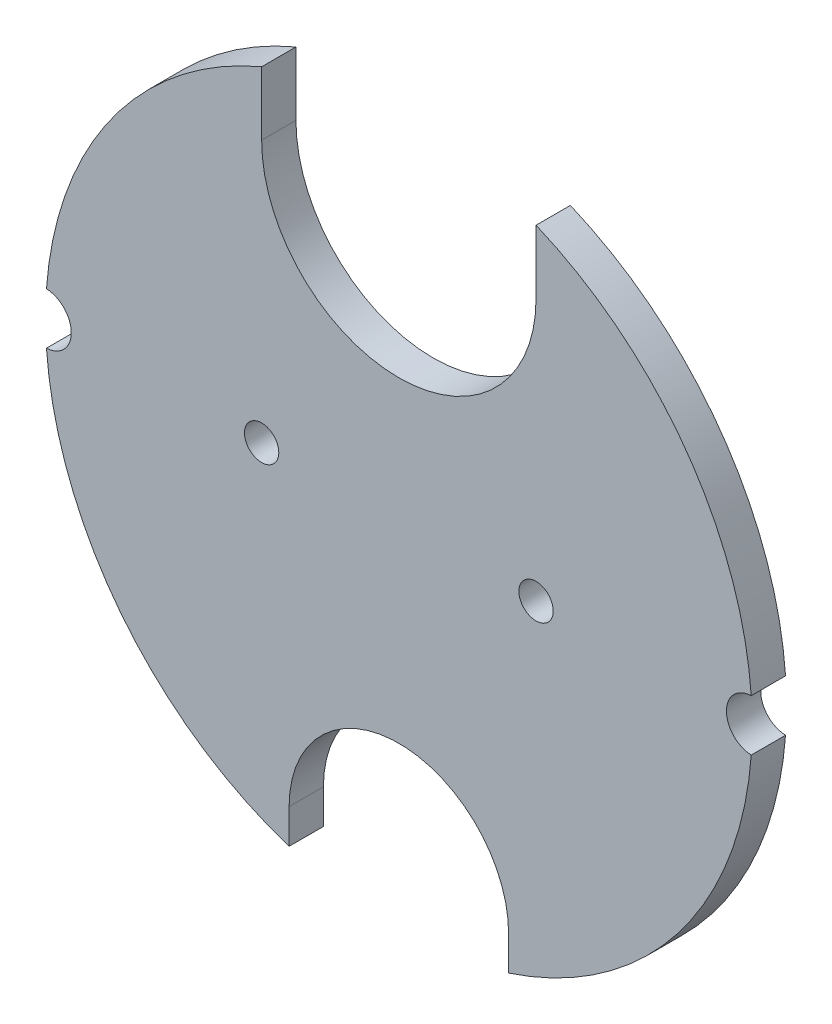
ISO-10303-21;
HEADER;
FILE_DESCRIPTION(('STEP AP214'),'2;1');
FILE_NAME('part.step','',(''),(''),'','','');
FILE_SCHEMA(('AUTOMOTIVE_DESIGN { 1 0 10303 214 1 1 1 1 }'));
ENDSEC;
DATA;
#1=APPLICATION_CONTEXT('core data for automotive mechanical design processes');
#2=APPLICATION_PROTOCOL_DEFINITION('international standard','automotive_design',2000,#1);
#3=PRODUCT_CONTEXT('',#1,'mechanical');
#4=PRODUCT('Part','Part','',(#3));
#5=PRODUCT_RELATED_PRODUCT_CATEGORY('part','',(#4));
#6=PRODUCT_DEFINITION_FORMATION('','',#4);
#7=PRODUCT_DEFINITION_CONTEXT('part definition',#1,'design');
#8=PRODUCT_DEFINITION('design','',#6,#7);
#9=PRODUCT_DEFINITION_SHAPE('','',#8);
#10=(LENGTH_UNIT() NAMED_UNIT(*) SI_UNIT(.MILLI.,.METRE.));
#11=(NAMED_UNIT(*) PLANE_ANGLE_UNIT() SI_UNIT($,.RADIAN.));
#12=(NAMED_UNIT(*) SI_UNIT($,.STERADIAN.) SOLID_ANGLE_UNIT());
#13=UNCERTAINTY_MEASURE_WITH_UNIT(LENGTH_MEASURE(1.E-05),#10,'distance_accuracy_value','');
#14=(GEOMETRIC_REPRESENTATION_CONTEXT(3) GLOBAL_UNCERTAINTY_ASSIGNED_CONTEXT((#13)) GLOBAL_UNIT_ASSIGNED_CONTEXT((#10,
#11,#12)) REPRESENTATION_CONTEXT('',''));
#15=CARTESIAN_POINT('',(0.,0.,0.));
#16=DIRECTION('',(0.,0.,1.));
#17=DIRECTION('',(1.,0.,0.));
#18=AXIS2_PLACEMENT_3D('',#15,#16,#17);
#19=CARTESIAN_POINT('',(0.,0.,6.35));
#20=DIRECTION('',(0.,0.,-1.));
#21=DIRECTION('',(-1.,0.,0.));
#22=AXIS2_PLACEMENT_3D('',#19,#20,#21);
#23=CYLINDRICAL_SURFACE('',#22,65.405);
#24=CARTESIAN_POINT('',(0.,0.,6.35));
#25=DIRECTION('',(0.,0.,1.));
#26=DIRECTION('',(1.,0.,0.));
#27=AXIS2_PLACEMENT_3D('',#24,#25,#26);
#28=CIRCLE('',#27,65.405);
#29=CARTESIAN_POINT('',(20.32,-62.1684134026275,6.35));
#30=VERTEX_POINT('',#29);
#31=CARTESIAN_POINT('',(65.2316080097087,-4.75934254574125,6.35));
#32=VERTEX_POINT('',#31);
#33=EDGE_CURVE('E223',#30,#32,#28,.T.);
#34=ORIENTED_EDGE('',*,*,#33,.F.);
#35=DIRECTION('',(0.,0.,-1.));
#36=VECTOR('',#35,1.);
#37=CARTESIAN_POINT('',(20.32,-62.1684134026275,6.35));
#38=LINE('',#37,#36);
#39=CARTESIAN_POINT('',(20.32,-62.1684134026275,0.));
#40=VERTEX_POINT('',#39);
#41=EDGE_CURVE('E159',#30,#40,#38,.T.);
#42=ORIENTED_EDGE('',*,*,#41,.T.);
#43=CARTESIAN_POINT('',(0.,0.,0.));
#44=DIRECTION('',(0.,0.,1.));
#45=DIRECTION('',(1.,0.,0.));
#46=AXIS2_PLACEMENT_3D('',#43,#44,#45);
#47=CIRCLE('',#46,65.405);
#48=CARTESIAN_POINT('',(65.2316080097087,-4.75934254574122,0.));
#49=VERTEX_POINT('',#48);
#50=EDGE_CURVE('E64',#40,#49,#47,.T.);
#51=ORIENTED_EDGE('',*,*,#50,.T.);
#52=DIRECTION('',(0.,0.,1.));
#53=VECTOR('',#52,1.);
#54=CARTESIAN_POINT('',(65.2316080097087,-4.75934254574125,3.175));
#55=LINE('',#54,#53);
#56=EDGE_CURVE('E182',#49,#32,#55,.T.);
#57=ORIENTED_EDGE('',*,*,#56,.T.);
#58=EDGE_LOOP('',(#34,#42,#51,#57));
#59=FACE_BOUND('',#58,.T.);
#60=ADVANCED_FACE('F41',(#59),#23,.T.);
#61=CARTESIAN_POINT('',(-65.2316080097087,-4.75934254574126,0.));
#62=VERTEX_POINT('',#61);
#63=CARTESIAN_POINT('',(-20.32,-62.1684134026275,0.));
#64=VERTEX_POINT('',#63);
#65=EDGE_CURVE('E228',#62,#64,#47,.T.);
#66=ORIENTED_EDGE('',*,*,#65,.T.);
#67=DIRECTION('',(0.,0.,-1.));
#68=VECTOR('',#67,1.);
#69=CARTESIAN_POINT('',(-20.32,-62.1684134026275,6.35));
#70=LINE('',#69,#68);
#71=CARTESIAN_POINT('',(-20.32,-62.1684134026275,6.35));
#72=VERTEX_POINT('',#71);
#73=EDGE_CURVE('E56',#64,#72,#70,.F.);
#74=ORIENTED_EDGE('',*,*,#73,.T.);
#75=CARTESIAN_POINT('',(-65.2316080097087,-4.75934254574126,6.35));
#76=VERTEX_POINT('',#75);
#77=EDGE_CURVE('E222',#76,#72,#28,.T.);
#78=ORIENTED_EDGE('',*,*,#77,.F.);
#79=DIRECTION('',(0.,0.,1.));
#80=VECTOR('',#79,1.);
#81=CARTESIAN_POINT('',(-65.2316080097087,-4.75934254574126,3.175));
#82=LINE('',#81,#80);
#83=EDGE_CURVE('E186',#76,#62,#82,.F.);
#84=ORIENTED_EDGE('',*,*,#83,.T.);
#85=EDGE_LOOP('',(#66,#74,#78,#84));
#86=FACE_BOUND('',#85,.T.);
#87=ADVANCED_FACE('F257',(#86),#23,.T.);
#88=CARTESIAN_POINT('',(-25.4,60.2715025945098,0.));
#89=VERTEX_POINT('',#88);
#90=CARTESIAN_POINT('',(-65.2316080097087,4.75934254574122,0.));
#91=VERTEX_POINT('',#90);
#92=EDGE_CURVE('E224',#89,#91,#47,.T.);
#93=ORIENTED_EDGE('',*,*,#92,.T.);
#94=DIRECTION('',(0.,0.,1.));
#95=VECTOR('',#94,1.);
#96=CARTESIAN_POINT('',(-65.2316080097087,4.75934254574126,3.175));
#97=LINE('',#96,#95);
#98=CARTESIAN_POINT('',(-65.2316080097087,4.75934254574126,6.35));
#99=VERTEX_POINT('',#98);
#100=EDGE_CURVE('E189',#91,#99,#97,.T.);
#101=ORIENTED_EDGE('',*,*,#100,.T.);
#102=CARTESIAN_POINT('',(-25.4,60.2715025945098,6.35));
#103=VERTEX_POINT('',#102);
#104=EDGE_CURVE('E218',#103,#99,#28,.T.);
#105=ORIENTED_EDGE('',*,*,#104,.F.);
#106=DIRECTION('',(0.,0.,-1.));
#107=VECTOR('',#106,1.);
#108=CARTESIAN_POINT('',(-25.4,60.2715025945098,6.35));
#109=LINE('',#108,#107);
#110=EDGE_CURVE('E214',#103,#89,#109,.T.);
#111=ORIENTED_EDGE('',*,*,#110,.T.);
#112=EDGE_LOOP('',(#93,#101,#105,#111));
#113=FACE_BOUND('',#112,.T.);
#114=ADVANCED_FACE('F234',(#113),#23,.T.);
#115=CARTESIAN_POINT('',(65.2316080097087,4.75934254574125,6.35));
#116=VERTEX_POINT('',#115);
#117=CARTESIAN_POINT('',(25.4,60.2715025945098,6.35));
#118=VERTEX_POINT('',#117);
#119=EDGE_CURVE('E227',#116,#118,#28,.T.);
#120=ORIENTED_EDGE('',*,*,#119,.F.);
#121=DIRECTION('',(0.,0.,1.));
#122=VECTOR('',#121,1.);
#123=CARTESIAN_POINT('',(65.2316080097087,4.75934254574125,3.175));
#124=LINE('',#123,#122);
#125=CARTESIAN_POINT('',(65.2316080097087,4.75934254574125,0.));
#126=VERTEX_POINT('',#125);
#127=EDGE_CURVE('E177',#116,#126,#124,.F.);
#128=ORIENTED_EDGE('',*,*,#127,.T.);
#129=CARTESIAN_POINT('',(25.4,60.2715025945098,0.));
#130=VERTEX_POINT('',#129);
#131=EDGE_CURVE('E217',#126,#130,#47,.T.);
#132=ORIENTED_EDGE('',*,*,#131,.T.);
#133=DIRECTION('',(0.,0.,-1.));
#134=VECTOR('',#133,1.);
#135=CARTESIAN_POINT('',(25.4,60.2715025945098,6.35));
#136=LINE('',#135,#134);
#137=EDGE_CURVE('E210',#130,#118,#136,.F.);
#138=ORIENTED_EDGE('',*,*,#137,.T.);
#139=EDGE_LOOP('',(#120,#128,#132,#138));
#140=FACE_BOUND('',#139,.T.);
#141=ADVANCED_FACE('F43',(#140),#23,.T.);
#142=CARTESIAN_POINT('',(0.,0.,6.35));
#143=DIRECTION('',(0.,0.,1.));
#144=DIRECTION('',(1.,0.,0.));
#145=AXIS2_PLACEMENT_3D('',#142,#143,#144);
#146=PLANE('',#145);
#147=DIRECTION('',(0.,1.,0.));
#148=VECTOR('',#147,1.);
#149=CARTESIAN_POINT('',(20.32,-55.8022147554524,6.35));
#150=LINE('',#149,#148);
#151=CARTESIAN_POINT('',(20.32,-55.8022147554524,6.35));
#152=VERTEX_POINT('',#151);
#153=EDGE_CURVE('E150',#30,#152,#150,.T.);
#154=ORIENTED_EDGE('',*,*,#153,.F.);
#155=ORIENTED_EDGE('',*,*,#33,.T.);
#156=CARTESIAN_POINT('',(65.405,0.,6.35));
#157=DIRECTION('',(0.,0.,1.));
#158=DIRECTION('',(1.,0.,0.));
#159=AXIS2_PLACEMENT_3D('',#156,#157,#158);
#160=CIRCLE('',#159,4.7625);
#161=EDGE_CURVE('E171',#116,#32,#160,.T.);
#162=ORIENTED_EDGE('',*,*,#161,.F.);
#163=ORIENTED_EDGE('',*,*,#119,.T.);
#164=DIRECTION('',(0.,1.,0.));
#165=VECTOR('',#164,1.);
#166=CARTESIAN_POINT('',(25.4,90.805,6.35));
#167=LINE('',#166,#165);
#168=CARTESIAN_POINT('',(25.4,48.5097738640335,6.35));
#169=VERTEX_POINT('',#168);
#170=EDGE_CURVE('E203',#169,#118,#167,.T.);
#171=ORIENTED_EDGE('',*,*,#170,.F.);
#172=CARTESIAN_POINT('',(0.,48.5097738640335,6.35));
#173=DIRECTION('',(0.,0.,1.));
#174=DIRECTION('',(-1.,0.,0.));
#175=AXIS2_PLACEMENT_3D('',#172,#173,#174);
#176=CIRCLE('',#175,25.4);
#177=CARTESIAN_POINT('',(-25.4,48.5097738640335,6.35));
#178=VERTEX_POINT('',#177);
#179=EDGE_CURVE('E192',#178,#169,#176,.T.);
#180=ORIENTED_EDGE('',*,*,#179,.F.);
#181=DIRECTION('',(0.,-1.,0.));
#182=VECTOR('',#181,1.);
#183=CARTESIAN_POINT('',(-25.4,48.5097738640335,6.35));
#184=LINE('',#183,#182);
#185=EDGE_CURVE('E197',#103,#178,#184,.T.);
#186=ORIENTED_EDGE('',*,*,#185,.F.);
#187=ORIENTED_EDGE('',*,*,#104,.T.);
#188=CARTESIAN_POINT('',(-65.405,0.,6.35));
#189=DIRECTION('',(0.,0.,1.));
#190=DIRECTION('',(1.,0.,0.));
#191=AXIS2_PLACEMENT_3D('',#188,#189,#190);
#192=CIRCLE('',#191,4.7625);
#193=EDGE_CURVE('E184',#76,#99,#192,.T.);
#194=ORIENTED_EDGE('',*,*,#193,.F.);
#195=ORIENTED_EDGE('',*,*,#77,.T.);
#196=DIRECTION('',(0.,-1.,0.));
#197=VECTOR('',#196,1.);
#198=CARTESIAN_POINT('',(-20.32,-68.5022147554524,6.35));
#199=LINE('',#198,#197);
#200=CARTESIAN_POINT('',(-20.32,-55.8022147554524,6.35));
#201=VERTEX_POINT('',#200);
#202=EDGE_CURVE('E152',#201,#72,#199,.T.);
#203=ORIENTED_EDGE('',*,*,#202,.F.);
#204=CARTESIAN_POINT('',(0.,-55.8022147554524,6.35));
#205=DIRECTION('',(0.,0.,1.));
#206=DIRECTION('',(-1.,0.,0.));
#207=AXIS2_PLACEMENT_3D('',#204,#205,#206);
#208=CIRCLE('',#207,20.32);
#209=EDGE_CURVE('E139',#152,#201,#208,.T.);
#210=ORIENTED_EDGE('',*,*,#209,.F.);
#211=EDGE_LOOP('',(#154,#155,#162,#163,#171,#180,#186,#187,#194,#195,#203,#210));
#212=FACE_BOUND('',#211,.T.);
#213=CARTESIAN_POINT('',(-25.4,0.,6.35));
#214=DIRECTION('',(0.,0.,1.));
#215=DIRECTION('',(1.,0.,0.));
#216=AXIS2_PLACEMENT_3D('',#213,#214,#215);
#217=CIRCLE('',#216,3.175);
#218=CARTESIAN_POINT('',(-22.225,0.,6.35));
#219=VERTEX_POINT('',#218);
#220=EDGE_CURVE('E161',#219,#219,#217,.T.);
#221=ORIENTED_EDGE('',*,*,#220,.F.);
#222=EDGE_LOOP('',(#221));
#223=FACE_BOUND('',#222,.T.);
#224=CARTESIAN_POINT('',(25.4,0.,6.35));
#225=DIRECTION('',(0.,0.,1.));
#226=DIRECTION('',(1.,0.,0.));
#227=AXIS2_PLACEMENT_3D('',#224,#225,#226);
#228=CIRCLE('',#227,3.175);
#229=CARTESIAN_POINT('',(28.575,0.,6.35));
#230=VERTEX_POINT('',#229);
#231=EDGE_CURVE('E165',#230,#230,#228,.T.);
#232=ORIENTED_EDGE('',*,*,#231,.F.);
#233=EDGE_LOOP('',(#232));
#234=FACE_BOUND('',#233,.T.);
#235=ADVANCED_FACE('F242',(#212,#223,#234),#146,.T.);
#236=CARTESIAN_POINT('',(0.,0.,0.));
#237=DIRECTION('',(0.,0.,1.));
#238=DIRECTION('',(1.,0.,0.));
#239=AXIS2_PLACEMENT_3D('',#236,#237,#238);
#240=PLANE('',#239);
#241=CARTESIAN_POINT('',(-25.4,0.,0.));
#242=DIRECTION('',(0.,0.,1.));
#243=DIRECTION('',(1.,0.,0.));
#244=AXIS2_PLACEMENT_3D('',#241,#242,#243);
#245=CIRCLE('',#244,3.175);
#246=CARTESIAN_POINT('',(-22.225,0.,0.));
#247=VERTEX_POINT('',#246);
#248=EDGE_CURVE('E162',#247,#247,#245,.T.);
#249=ORIENTED_EDGE('',*,*,#248,.T.);
#250=EDGE_LOOP('',(#249));
#251=FACE_BOUND('',#250,.T.);
#252=CARTESIAN_POINT('',(25.4,0.,0.));
#253=DIRECTION('',(0.,0.,1.));
#254=DIRECTION('',(1.,0.,0.));
#255=AXIS2_PLACEMENT_3D('',#252,#253,#254);
#256=CIRCLE('',#255,3.175);
#257=CARTESIAN_POINT('',(28.575,0.,0.));
#258=VERTEX_POINT('',#257);
#259=EDGE_CURVE('E168',#258,#258,#256,.T.);
#260=ORIENTED_EDGE('',*,*,#259,.T.);
#261=EDGE_LOOP('',(#260));
#262=FACE_BOUND('',#261,.T.);
#263=ORIENTED_EDGE('',*,*,#50,.F.);
#264=DIRECTION('',(0.,1.,0.));
#265=VECTOR('',#264,1.);
#266=CARTESIAN_POINT('',(20.32,0.,0.));
#267=LINE('',#266,#265);
#268=CARTESIAN_POINT('',(20.32,-55.8022147554524,0.));
#269=VERTEX_POINT('',#268);
#270=EDGE_CURVE('E11',#40,#269,#267,.T.);
#271=ORIENTED_EDGE('',*,*,#270,.T.);
#272=CARTESIAN_POINT('',(0.,-55.8022147554524,0.));
#273=DIRECTION('',(0.,0.,1.));
#274=DIRECTION('',(-1.,0.,0.));
#275=AXIS2_PLACEMENT_3D('',#272,#273,#274);
#276=CIRCLE('',#275,20.32);
#277=CARTESIAN_POINT('',(-20.32,-55.8022147554524,0.));
#278=VERTEX_POINT('',#277);
#279=EDGE_CURVE('E137',#269,#278,#276,.T.);
#280=ORIENTED_EDGE('',*,*,#279,.T.);
#281=DIRECTION('',(0.,-1.,0.));
#282=VECTOR('',#281,1.);
#283=CARTESIAN_POINT('',(-20.32,-68.5022147554524,0.));
#284=LINE('',#283,#282);
#285=EDGE_CURVE('E142',#278,#64,#284,.T.);
#286=ORIENTED_EDGE('',*,*,#285,.T.);
#287=ORIENTED_EDGE('',*,*,#65,.F.);
#288=CARTESIAN_POINT('',(-65.405,0.,0.));
#289=DIRECTION('',(0.,0.,1.));
#290=DIRECTION('',(1.,0.,0.));
#291=AXIS2_PLACEMENT_3D('',#288,#289,#290);
#292=CIRCLE('',#291,4.7625);
#293=EDGE_CURVE('E49',#62,#91,#292,.T.);
#294=ORIENTED_EDGE('',*,*,#293,.T.);
#295=ORIENTED_EDGE('',*,*,#92,.F.);
#296=DIRECTION('',(0.,-1.,0.));
#297=VECTOR('',#296,1.);
#298=CARTESIAN_POINT('',(-25.4,0.,0.));
#299=LINE('',#298,#297);
#300=CARTESIAN_POINT('',(-25.4,48.5097738640335,0.));
#301=VERTEX_POINT('',#300);
#302=EDGE_CURVE('E221',#89,#301,#299,.T.);
#303=ORIENTED_EDGE('',*,*,#302,.T.);
#304=CARTESIAN_POINT('',(0.,48.5097738640335,0.));
#305=DIRECTION('',(0.,0.,1.));
#306=DIRECTION('',(-1.,0.,0.));
#307=AXIS2_PLACEMENT_3D('',#304,#305,#306);
#308=CIRCLE('',#307,25.4);
#309=CARTESIAN_POINT('',(25.4,48.5097738640335,0.));
#310=VERTEX_POINT('',#309);
#311=EDGE_CURVE('E193',#301,#310,#308,.T.);
#312=ORIENTED_EDGE('',*,*,#311,.T.);
#313=DIRECTION('',(0.,1.,0.));
#314=VECTOR('',#313,1.);
#315=CARTESIAN_POINT('',(25.4,60.2715025945098,0.));
#316=LINE('',#315,#314);
#317=EDGE_CURVE('E196',#310,#130,#316,.T.);
#318=ORIENTED_EDGE('',*,*,#317,.T.);
#319=ORIENTED_EDGE('',*,*,#131,.F.);
#320=CARTESIAN_POINT('',(65.405,0.,0.));
#321=DIRECTION('',(0.,0.,1.));
#322=DIRECTION('',(1.,0.,0.));
#323=AXIS2_PLACEMENT_3D('',#320,#321,#322);
#324=CIRCLE('',#323,4.7625);
#325=EDGE_CURVE('E174',#126,#49,#324,.T.);
#326=ORIENTED_EDGE('',*,*,#325,.T.);
#327=EDGE_LOOP('',(#263,#271,#280,#286,#287,#294,#295,#303,#312,#318,#319,#326));
#328=FACE_BOUND('',#327,.T.);
#329=ADVANCED_FACE('F149',(#251,#262,#328),#240,.F.);
#330=CARTESIAN_POINT('',(-25.4,48.5097738640335,0.));
#331=DIRECTION('',(-1.,0.,0.));
#332=DIRECTION('',(0.,0.,1.));
#333=AXIS2_PLACEMENT_3D('',#330,#331,#332);
#334=PLANE('',#333);
#335=ORIENTED_EDGE('',*,*,#185,.T.);
#336=DIRECTION('',(0.,0.,1.));
#337=VECTOR('',#336,1.);
#338=CARTESIAN_POINT('',(-25.4,48.5097738640335,0.));
#339=LINE('',#338,#337);
#340=EDGE_CURVE('E207',#301,#178,#339,.T.);
#341=ORIENTED_EDGE('',*,*,#340,.F.);
#342=ORIENTED_EDGE('',*,*,#302,.F.);
#343=ORIENTED_EDGE('',*,*,#110,.F.);
#344=EDGE_LOOP('',(#335,#341,#342,#343));
#345=FACE_BOUND('',#344,.T.);
#346=ADVANCED_FACE('F238',(#345),#334,.F.);
#347=CARTESIAN_POINT('',(25.4,90.805,0.));
#348=DIRECTION('',(1.,0.,0.));
#349=DIRECTION('',(0.,1.,0.));
#350=AXIS2_PLACEMENT_3D('',#347,#348,#349);
#351=PLANE('',#350);
#352=ORIENTED_EDGE('',*,*,#317,.F.);
#353=DIRECTION('',(0.,0.,1.));
#354=VECTOR('',#353,1.);
#355=CARTESIAN_POINT('',(25.4,48.5097738640335,0.));
#356=LINE('',#355,#354);
#357=EDGE_CURVE('E200',#310,#169,#356,.T.);
#358=ORIENTED_EDGE('',*,*,#357,.T.);
#359=ORIENTED_EDGE('',*,*,#170,.T.);
#360=ORIENTED_EDGE('',*,*,#137,.F.);
#361=EDGE_LOOP('',(#352,#358,#359,#360));
#362=FACE_BOUND('',#361,.T.);
#363=ADVANCED_FACE('F253',(#362),#351,.F.);
#364=CARTESIAN_POINT('',(0.,48.5097738640335,0.));
#365=DIRECTION('',(0.,0.,1.));
#366=DIRECTION('',(1.,0.,0.));
#367=AXIS2_PLACEMENT_3D('',#364,#365,#366);
#368=CYLINDRICAL_SURFACE('',#367,25.4);
#369=ORIENTED_EDGE('',*,*,#179,.T.);
#370=ORIENTED_EDGE('',*,*,#357,.F.);
#371=ORIENTED_EDGE('',*,*,#311,.F.);
#372=ORIENTED_EDGE('',*,*,#340,.T.);
#373=EDGE_LOOP('',(#369,#370,#371,#372));
#374=FACE_BOUND('',#373,.T.);
#375=ADVANCED_FACE('F247',(#374),#368,.F.);
#376=CARTESIAN_POINT('',(-65.405,0.,0.));
#377=DIRECTION('',(0.,0.,1.));
#378=DIRECTION('',(1.,0.,0.));
#379=AXIS2_PLACEMENT_3D('',#376,#377,#378);
#380=CYLINDRICAL_SURFACE('',#379,4.7625);
#381=ORIENTED_EDGE('',*,*,#293,.F.);
#382=ORIENTED_EDGE('',*,*,#83,.F.);
#383=ORIENTED_EDGE('',*,*,#193,.T.);
#384=ORIENTED_EDGE('',*,*,#100,.F.);
#385=EDGE_LOOP('',(#381,#382,#383,#384));
#386=FACE_BOUND('',#385,.T.);
#387=ADVANCED_FACE('F260',(#386),#380,.F.);
#388=CARTESIAN_POINT('',(65.405,0.,0.));
#389=DIRECTION('',(0.,0.,1.));
#390=DIRECTION('',(1.,0.,0.));
#391=AXIS2_PLACEMENT_3D('',#388,#389,#390);
#392=CYLINDRICAL_SURFACE('',#391,4.7625);
#393=ORIENTED_EDGE('',*,*,#325,.F.);
#394=ORIENTED_EDGE('',*,*,#127,.F.);
#395=ORIENTED_EDGE('',*,*,#161,.T.);
#396=ORIENTED_EDGE('',*,*,#56,.F.);
#397=EDGE_LOOP('',(#393,#394,#395,#396));
#398=FACE_BOUND('',#397,.T.);
#399=ADVANCED_FACE('F264',(#398),#392,.F.);
#400=CARTESIAN_POINT('',(25.4,0.,0.));
#401=DIRECTION('',(0.,0.,1.));
#402=DIRECTION('',(1.,0.,0.));
#403=AXIS2_PLACEMENT_3D('',#400,#401,#402);
#404=CYLINDRICAL_SURFACE('',#403,3.175);
#405=ORIENTED_EDGE('',*,*,#259,.F.);
#406=EDGE_LOOP('',(#405));
#407=FACE_BOUND('',#406,.T.);
#408=ORIENTED_EDGE('',*,*,#231,.T.);
#409=EDGE_LOOP('',(#408));
#410=FACE_BOUND('',#409,.T.);
#411=ADVANCED_FACE('F275',(#407,#410),#404,.F.);
#412=CARTESIAN_POINT('',(-25.4,0.,0.));
#413=DIRECTION('',(0.,0.,1.));
#414=DIRECTION('',(1.,0.,0.));
#415=AXIS2_PLACEMENT_3D('',#412,#413,#414);
#416=CYLINDRICAL_SURFACE('',#415,3.175);
#417=ORIENTED_EDGE('',*,*,#248,.F.);
#418=EDGE_LOOP('',(#417));
#419=FACE_BOUND('',#418,.T.);
#420=ORIENTED_EDGE('',*,*,#220,.T.);
#421=EDGE_LOOP('',(#420));
#422=FACE_BOUND('',#421,.T.);
#423=ADVANCED_FACE('F268',(#419,#422),#416,.F.);
#424=CARTESIAN_POINT('',(20.32,-55.8022147554524,0.));
#425=DIRECTION('',(1.,0.,0.));
#426=DIRECTION('',(0.,1.,0.));
#427=AXIS2_PLACEMENT_3D('',#424,#425,#426);
#428=PLANE('',#427);
#429=ORIENTED_EDGE('',*,*,#153,.T.);
#430=DIRECTION('',(0.,0.,1.));
#431=VECTOR('',#430,1.);
#432=CARTESIAN_POINT('',(20.32,-55.8022147554524,0.));
#433=LINE('',#432,#431);
#434=EDGE_CURVE('E141',#269,#152,#433,.T.);
#435=ORIENTED_EDGE('',*,*,#434,.F.);
#436=ORIENTED_EDGE('',*,*,#270,.F.);
#437=ORIENTED_EDGE('',*,*,#41,.F.);
#438=EDGE_LOOP('',(#429,#435,#436,#437));
#439=FACE_BOUND('',#438,.T.);
#440=ADVANCED_FACE('F266',(#439),#428,.F.);
#441=CARTESIAN_POINT('',(-20.32,-68.5022147554524,0.));
#442=DIRECTION('',(-1.,0.,0.));
#443=DIRECTION('',(0.,-1.,0.));
#444=AXIS2_PLACEMENT_3D('',#441,#442,#443);
#445=PLANE('',#444);
#446=ORIENTED_EDGE('',*,*,#285,.F.);
#447=DIRECTION('',(0.,0.,1.));
#448=VECTOR('',#447,1.);
#449=CARTESIAN_POINT('',(-20.32,-55.8022147554524,0.));
#450=LINE('',#449,#448);
#451=EDGE_CURVE('E133',#278,#201,#450,.T.);
#452=ORIENTED_EDGE('',*,*,#451,.T.);
#453=ORIENTED_EDGE('',*,*,#202,.T.);
#454=ORIENTED_EDGE('',*,*,#73,.F.);
#455=EDGE_LOOP('',(#446,#452,#453,#454));
#456=FACE_BOUND('',#455,.T.);
#457=ADVANCED_FACE('F144',(#456),#445,.F.);
#458=CARTESIAN_POINT('',(0.,-55.8022147554524,0.));
#459=DIRECTION('',(0.,0.,1.));
#460=DIRECTION('',(1.,0.,0.));
#461=AXIS2_PLACEMENT_3D('',#458,#459,#460);
#462=CYLINDRICAL_SURFACE('',#461,20.32);
#463=ORIENTED_EDGE('',*,*,#209,.T.);
#464=ORIENTED_EDGE('',*,*,#451,.F.);
#465=ORIENTED_EDGE('',*,*,#279,.F.);
#466=ORIENTED_EDGE('',*,*,#434,.T.);
#467=EDGE_LOOP('',(#463,#464,#465,#466));
#468=FACE_BOUND('',#467,.T.);
#469=ADVANCED_FACE('F134',(#468),#462,.F.);
#470=CLOSED_SHELL('',(#60,#87,#114,#141,#235,#329,#346,#363,#375,#387,#399,#411,#423,#440,#457,#469));
#471=MANIFOLD_SOLID_BREP('B2',#470);
#472=ADVANCED_BREP_SHAPE_REPRESENTATION('',(#18,#471),#14);
#473=SHAPE_DEFINITION_REPRESENTATION(#9,#472);
ENDSEC;
END-ISO-10303-21;
